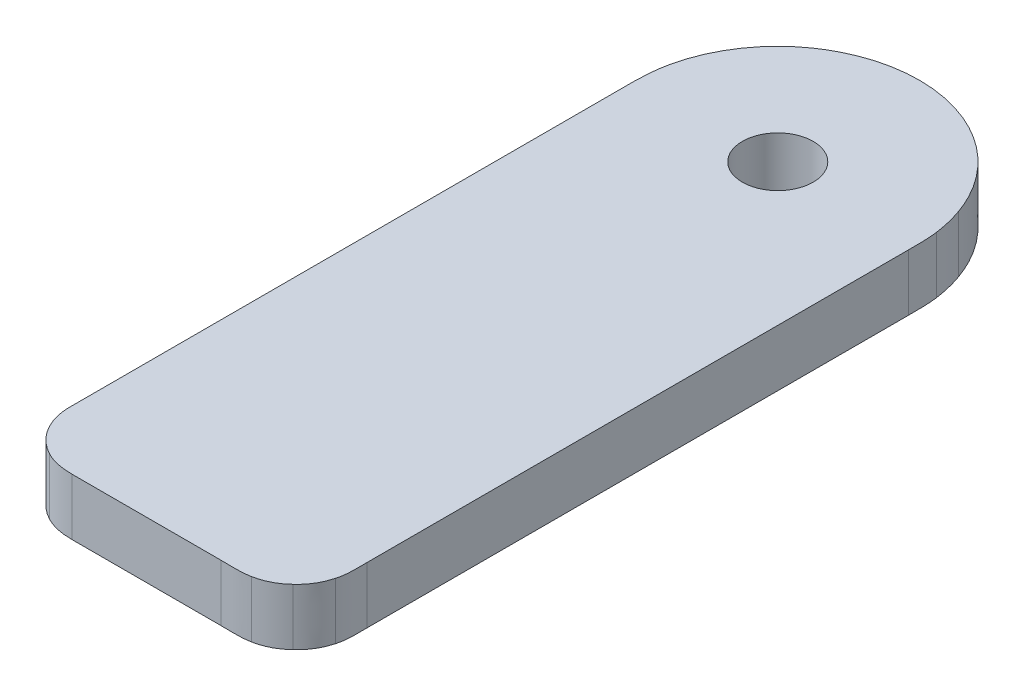
ISO-10303-21;
HEADER;
FILE_DESCRIPTION(('STEP AP214'),'2;1');
FILE_NAME('part.step','',(''),(''),'','','');
FILE_SCHEMA(('AUTOMOTIVE_DESIGN { 1 0 10303 214 1 1 1 1 }'));
ENDSEC;
DATA;
#1=APPLICATION_CONTEXT('core data for automotive mechanical design processes');
#2=APPLICATION_PROTOCOL_DEFINITION('international standard','automotive_design',2000,#1);
#3=PRODUCT_CONTEXT('',#1,'mechanical');
#4=PRODUCT('Part','Part','',(#3));
#5=PRODUCT_RELATED_PRODUCT_CATEGORY('part','',(#4));
#6=PRODUCT_DEFINITION_FORMATION('','',#4);
#7=PRODUCT_DEFINITION_CONTEXT('part definition',#1,'design');
#8=PRODUCT_DEFINITION('design','',#6,#7);
#9=PRODUCT_DEFINITION_SHAPE('','',#8);
#10=(LENGTH_UNIT() NAMED_UNIT(*) SI_UNIT(.MILLI.,.METRE.));
#11=(NAMED_UNIT(*) PLANE_ANGLE_UNIT() SI_UNIT($,.RADIAN.));
#12=(NAMED_UNIT(*) SI_UNIT($,.STERADIAN.) SOLID_ANGLE_UNIT());
#13=UNCERTAINTY_MEASURE_WITH_UNIT(LENGTH_MEASURE(1.E-05),#10,'distance_accuracy_value','');
#14=(GEOMETRIC_REPRESENTATION_CONTEXT(3) GLOBAL_UNCERTAINTY_ASSIGNED_CONTEXT((#13)) GLOBAL_UNIT_ASSIGNED_CONTEXT((#10,
#11,#12)) REPRESENTATION_CONTEXT('',''));
#15=CARTESIAN_POINT('',(0.,0.,0.));
#16=DIRECTION('',(0.,0.,1.));
#17=DIRECTION('',(1.,0.,0.));
#18=AXIS2_PLACEMENT_3D('',#15,#16,#17);
#19=CARTESIAN_POINT('',(3.65328200000971,6.35,-0.952753999994893));
#20=CARTESIAN_POINT('',(1.53731761965444,6.35,-2.04532759899768));
#21=CARTESIAN_POINT('',(0.219425103483956,6.35,-4.22738339059295));
#22=CARTESIAN_POINT('',(0.228904799999956,6.35,-6.61454614173407));
#23=B_SPLINE_CURVE_WITH_KNOTS('',3,(#19,#20,#21,#22),.UNSPECIFIED.,.F.,.F.,(4,4),
(-1.54492839249472E-12,1.00358621175948),.UNSPECIFIED.);
#24=DIRECTION('',(0.,-1.,0.));
#25=VECTOR('',#24,1.);
#26=SURFACE_OF_LINEAR_EXTRUSION('',#23,#25);
#27=CARTESIAN_POINT('',(3.65328200000971,0.,-0.952753999994893));
#28=CARTESIAN_POINT('',(1.53731761965444,0.,-2.04532759899768));
#29=CARTESIAN_POINT('',(0.219425103483956,0.,-4.22738339059295));
#30=CARTESIAN_POINT('',(0.228904799999956,0.,-6.61454614173407));
#31=B_SPLINE_CURVE_WITH_KNOTS('',3,(#27,#28,#29,#30),.UNSPECIFIED.,.F.,.F.,(4,4),
(-1.54492839249472E-12,1.00358621175948),.UNSPECIFIED.);
#32=CARTESIAN_POINT('',(3.653282,0.,-0.952754));
#33=VERTEX_POINT('',#32);
#34=CARTESIAN_POINT('',(0.2289048,0.,-6.61200614173541));
#35=VERTEX_POINT('',#34);
#36=EDGE_CURVE('E320',#33,#35,#31,.T.);
#37=ORIENTED_EDGE('',*,*,#36,.F.);
#38=DIRECTION('',(0.,-1.,0.));
#39=VECTOR('',#38,1.);
#40=CARTESIAN_POINT('',(3.653282,6.35,-0.952754));
#41=LINE('',#40,#39);
#42=CARTESIAN_POINT('',(3.653282,6.35,-0.952754));
#43=VERTEX_POINT('',#42);
#44=EDGE_CURVE('E11',#43,#33,#41,.T.);
#45=ORIENTED_EDGE('',*,*,#44,.F.);
#46=CARTESIAN_POINT('',(0.2289048,6.35,-6.61200614173541));
#47=VERTEX_POINT('',#46);
#48=EDGE_CURVE('E281',#43,#47,#23,.T.);
#49=ORIENTED_EDGE('',*,*,#48,.T.);
#50=DIRECTION('',(0.,-1.,0.));
#51=VECTOR('',#50,1.);
#52=CARTESIAN_POINT('',(0.2289048,6.35,-6.61200614173541));
#53=LINE('',#52,#51);
#54=EDGE_CURVE('E49',#47,#35,#53,.T.);
#55=ORIENTED_EDGE('',*,*,#54,.T.);
#56=EDGE_LOOP('',(#37,#45,#49,#55));
#57=FACE_BOUND('',#56,.T.);
#58=ADVANCED_FACE('F32',(#57),#26,.T.);
#59=CARTESIAN_POINT('',(6.8778882,6.35,-0.2430526));
#60=CARTESIAN_POINT('',(5.7272428,6.35,-0.2430526));
#61=CARTESIAN_POINT('',(4.7006002,6.35,-0.4155694));
#62=CARTESIAN_POINT('',(3.653282,6.35,-0.952754));
#63=B_SPLINE_CURVE_WITH_KNOTS('',3,(#59,#60,#61,#62),.UNSPECIFIED.,.F.,.F.,(4,4),(0.,1.),.UNSPECIFIED.);
#64=DIRECTION('',(0.,-1.,0.));
#65=VECTOR('',#64,1.);
#66=SURFACE_OF_LINEAR_EXTRUSION('',#63,#65);
#67=CARTESIAN_POINT('',(6.8778882,0.,-0.2430526));
#68=CARTESIAN_POINT('',(5.7272428,0.,-0.2430526));
#69=CARTESIAN_POINT('',(4.7006002,0.,-0.4155694));
#70=CARTESIAN_POINT('',(3.653282,0.,-0.952754));
#71=B_SPLINE_CURVE_WITH_KNOTS('',3,(#67,#68,#69,#70),.UNSPECIFIED.,.F.,.F.,(4,4),(0.,1.),.UNSPECIFIED.);
#72=CARTESIAN_POINT('',(6.8778882,0.,-0.2430526));
#73=VERTEX_POINT('',#72);
#74=EDGE_CURVE('E318',#73,#33,#71,.T.);
#75=ORIENTED_EDGE('',*,*,#74,.F.);
#76=DIRECTION('',(0.,-1.,0.));
#77=VECTOR('',#76,1.);
#78=CARTESIAN_POINT('',(6.8778882,6.35,-0.2430526));
#79=LINE('',#78,#77);
#80=CARTESIAN_POINT('',(6.8778882,6.35,-0.2430526));
#81=VERTEX_POINT('',#80);
#82=EDGE_CURVE('E41',#81,#73,#79,.T.);
#83=ORIENTED_EDGE('',*,*,#82,.F.);
#84=EDGE_CURVE('E275',#81,#43,#63,.T.);
#85=ORIENTED_EDGE('',*,*,#84,.T.);
#86=ORIENTED_EDGE('',*,*,#44,.T.);
#87=EDGE_LOOP('',(#75,#83,#85,#86));
#88=FACE_BOUND('',#87,.T.);
#89=ADVANCED_FACE('F270',(#88),#66,.T.);
#90=CARTESIAN_POINT('',(0.,6.35,-0.2430526));
#91=DIRECTION('',(0.,0.,1.));
#92=DIRECTION('',(1.,0.,0.));
#93=AXIS2_PLACEMENT_3D('',#90,#91,#92);
#94=PLANE('',#93);
#95=DIRECTION('',(-1.,0.,0.));
#96=VECTOR('',#95,1.);
#97=CARTESIAN_POINT('',(0.,0.,-0.2430526));
#98=LINE('',#97,#96);
#99=CARTESIAN_POINT('',(23.5728256,0.,-0.2430526));
#100=VERTEX_POINT('',#99);
#101=EDGE_CURVE('E315',#100,#73,#98,.T.);
#102=ORIENTED_EDGE('',*,*,#101,.F.);
#103=DIRECTION('',(0.,-1.,0.));
#104=VECTOR('',#103,1.);
#105=CARTESIAN_POINT('',(23.5728256,6.35,-0.2430526));
#106=LINE('',#105,#104);
#107=CARTESIAN_POINT('',(23.5728256,6.35,-0.2430526));
#108=VERTEX_POINT('',#107);
#109=EDGE_CURVE('E293',#108,#100,#106,.T.);
#110=ORIENTED_EDGE('',*,*,#109,.F.);
#111=DIRECTION('',(-1.,0.,0.));
#112=VECTOR('',#111,1.);
#113=CARTESIAN_POINT('',(0.,6.35,-0.2430526));
#114=LINE('',#113,#112);
#115=EDGE_CURVE('E280',#108,#81,#114,.T.);
#116=ORIENTED_EDGE('',*,*,#115,.T.);
#117=ORIENTED_EDGE('',*,*,#82,.T.);
#118=EDGE_LOOP('',(#102,#110,#116,#117));
#119=FACE_BOUND('',#118,.T.);
#120=ADVANCED_FACE('F267',(#119),#94,.T.);
#121=CARTESIAN_POINT('',(26.8525752,6.35,-0.3600704));
#122=CARTESIAN_POINT('',(25.756997,6.35,-0.146558));
#123=CARTESIAN_POINT('',(24.6683784,6.35,-0.2430526));
#124=CARTESIAN_POINT('',(23.5728256,6.35,-0.2430526));
#125=B_SPLINE_CURVE_WITH_KNOTS('',3,(#121,#122,#123,#124),.UNSPECIFIED.,.F.,.F.,(4,4),(0.,1.),.UNSPECIFIED.);
#126=DIRECTION('',(0.,-1.,0.));
#127=VECTOR('',#126,1.);
#128=SURFACE_OF_LINEAR_EXTRUSION('',#125,#127);
#129=CARTESIAN_POINT('',(26.8525752,0.,-0.3600704));
#130=CARTESIAN_POINT('',(25.756997,0.,-0.146558));
#131=CARTESIAN_POINT('',(24.6683784,0.,-0.2430526));
#132=CARTESIAN_POINT('',(23.5728256,0.,-0.2430526));
#133=B_SPLINE_CURVE_WITH_KNOTS('',3,(#129,#130,#131,#132),.UNSPECIFIED.,.F.,.F.,(4,4),(0.,1.),.UNSPECIFIED.);
#134=CARTESIAN_POINT('',(26.8525752,0.,-0.3600704));
#135=VERTEX_POINT('',#134);
#136=EDGE_CURVE('E324',#135,#100,#133,.T.);
#137=ORIENTED_EDGE('',*,*,#136,.F.);
#138=DIRECTION('',(0.,-1.,0.));
#139=VECTOR('',#138,1.);
#140=CARTESIAN_POINT('',(26.8525752,6.35,-0.3600704));
#141=LINE('',#140,#139);
#142=CARTESIAN_POINT('',(26.8525752,6.35,-0.3600704));
#143=VERTEX_POINT('',#142);
#144=EDGE_CURVE('E295',#143,#135,#141,.T.);
#145=ORIENTED_EDGE('',*,*,#144,.F.);
#146=EDGE_CURVE('E252',#143,#108,#125,.T.);
#147=ORIENTED_EDGE('',*,*,#146,.T.);
#148=ORIENTED_EDGE('',*,*,#109,.T.);
#149=EDGE_LOOP('',(#137,#145,#147,#148));
#150=FACE_BOUND('',#149,.T.);
#151=ADVANCED_FACE('F263',(#150),#128,.T.);
#152=CARTESIAN_POINT('',(29.939361,6.35,-1.9310096));
#153=CARTESIAN_POINT('',(29.0298632,6.35,-1.0835132));
#154=CARTESIAN_POINT('',(28.0721054,6.35,-0.601218));
#155=CARTESIAN_POINT('',(26.8525752,6.35,-0.3600704));
#156=B_SPLINE_CURVE_WITH_KNOTS('',3,(#152,#153,#154,#155),.UNSPECIFIED.,.F.,.F.,(4,4),(0.,1.),.UNSPECIFIED.);
#157=DIRECTION('',(0.,-1.,0.));
#158=VECTOR('',#157,1.);
#159=SURFACE_OF_LINEAR_EXTRUSION('',#156,#158);
#160=CARTESIAN_POINT('',(29.939361,0.,-1.9310096));
#161=CARTESIAN_POINT('',(29.0298632,0.,-1.0835132));
#162=CARTESIAN_POINT('',(28.0721054,0.,-0.601218));
#163=CARTESIAN_POINT('',(26.8525752,0.,-0.3600704));
#164=B_SPLINE_CURVE_WITH_KNOTS('',3,(#160,#161,#162,#163),.UNSPECIFIED.,.F.,.F.,(4,4),(0.,1.),.UNSPECIFIED.);
#165=CARTESIAN_POINT('',(29.939361,0.,-1.9310096));
#166=VERTEX_POINT('',#165);
#167=EDGE_CURVE('E302',#166,#135,#164,.T.);
#168=ORIENTED_EDGE('',*,*,#167,.F.);
#169=DIRECTION('',(0.,-1.,0.));
#170=VECTOR('',#169,1.);
#171=CARTESIAN_POINT('',(29.939361,6.35,-1.9310096));
#172=LINE('',#171,#170);
#173=CARTESIAN_POINT('',(29.939361,6.35,-1.9310096));
#174=VERTEX_POINT('',#173);
#175=EDGE_CURVE('E300',#174,#166,#172,.T.);
#176=ORIENTED_EDGE('',*,*,#175,.F.);
#177=EDGE_CURVE('E243',#174,#143,#156,.T.);
#178=ORIENTED_EDGE('',*,*,#177,.T.);
#179=ORIENTED_EDGE('',*,*,#144,.T.);
#180=EDGE_LOOP('',(#168,#176,#178,#179));
#181=FACE_BOUND('',#180,.T.);
#182=ADVANCED_FACE('F260',(#181),#159,.T.);
#183=CARTESIAN_POINT('',(31.7514732,6.35,-4.9144682));
#184=CARTESIAN_POINT('',(31.4207398,6.35,-3.7087048));
#185=CARTESIAN_POINT('',(30.8557676,6.35,-2.778506));
#186=CARTESIAN_POINT('',(29.939361,6.35,-1.9310096));
#187=B_SPLINE_CURVE_WITH_KNOTS('',3,(#183,#184,#185,#186),.UNSPECIFIED.,.F.,.F.,(4,4),(0.,1.),.UNSPECIFIED.);
#188=DIRECTION('',(0.,-1.,0.));
#189=VECTOR('',#188,1.);
#190=SURFACE_OF_LINEAR_EXTRUSION('',#187,#189);
#191=CARTESIAN_POINT('',(31.7514732,0.,-4.9144682));
#192=CARTESIAN_POINT('',(31.4207398,0.,-3.7087048));
#193=CARTESIAN_POINT('',(30.8557676,0.,-2.778506));
#194=CARTESIAN_POINT('',(29.939361,0.,-1.9310096));
#195=B_SPLINE_CURVE_WITH_KNOTS('',3,(#191,#192,#193,#194),.UNSPECIFIED.,.F.,.F.,(4,4),(0.,1.),.UNSPECIFIED.);
#196=CARTESIAN_POINT('',(31.7514732,0.,-4.9144682));
#197=VERTEX_POINT('',#196);
#198=EDGE_CURVE('E339',#197,#166,#195,.T.);
#199=ORIENTED_EDGE('',*,*,#198,.F.);
#200=DIRECTION('',(0.,-1.,0.));
#201=VECTOR('',#200,1.);
#202=CARTESIAN_POINT('',(31.7514732,6.35,-4.9144682));
#203=LINE('',#202,#201);
#204=CARTESIAN_POINT('',(31.7514732,6.35,-4.9144682));
#205=VERTEX_POINT('',#204);
#206=EDGE_CURVE('E306',#205,#197,#203,.T.);
#207=ORIENTED_EDGE('',*,*,#206,.F.);
#208=EDGE_CURVE('E234',#205,#174,#187,.T.);
#209=ORIENTED_EDGE('',*,*,#208,.T.);
#210=ORIENTED_EDGE('',*,*,#175,.T.);
#211=EDGE_LOOP('',(#199,#207,#209,#210));
#212=FACE_BOUND('',#211,.T.);
#213=ADVANCED_FACE('F225',(#212),#190,.T.);
#214=CARTESIAN_POINT('',(31.9788794,6.35,-8.187309));
#215=CARTESIAN_POINT('',(31.9788794,6.35,-7.0917562));
#216=CARTESIAN_POINT('',(32.0547238,6.35,-6.010021));
#217=CARTESIAN_POINT('',(31.7514732,6.35,-4.9144682));
#218=B_SPLINE_CURVE_WITH_KNOTS('',3,(#214,#215,#216,#217),.UNSPECIFIED.,.F.,.F.,(4,4),(0.,1.),.UNSPECIFIED.);
#219=DIRECTION('',(0.,-1.,0.));
#220=VECTOR('',#219,1.);
#221=SURFACE_OF_LINEAR_EXTRUSION('',#218,#220);
#222=CARTESIAN_POINT('',(31.9788794,0.,-8.187309));
#223=CARTESIAN_POINT('',(31.9788794,0.,-7.0917562));
#224=CARTESIAN_POINT('',(32.0547238,0.,-6.010021));
#225=CARTESIAN_POINT('',(31.7514732,0.,-4.9144682));
#226=B_SPLINE_CURVE_WITH_KNOTS('',3,(#222,#223,#224,#225),.UNSPECIFIED.,.F.,.F.,(4,4),(0.,1.),.UNSPECIFIED.);
#227=CARTESIAN_POINT('',(31.9788794,0.,-8.187309));
#228=VERTEX_POINT('',#227);
#229=EDGE_CURVE('E346',#228,#197,#226,.T.);
#230=ORIENTED_EDGE('',*,*,#229,.F.);
#231=DIRECTION('',(0.,-1.,0.));
#232=VECTOR('',#231,1.);
#233=CARTESIAN_POINT('',(31.9788794,6.35,-8.187309));
#234=LINE('',#233,#232);
#235=CARTESIAN_POINT('',(31.9788794,6.35,-8.187309));
#236=VERTEX_POINT('',#235);
#237=EDGE_CURVE('E309',#236,#228,#234,.T.);
#238=ORIENTED_EDGE('',*,*,#237,.F.);
#239=EDGE_CURVE('E229',#236,#205,#218,.T.);
#240=ORIENTED_EDGE('',*,*,#239,.T.);
#241=ORIENTED_EDGE('',*,*,#206,.T.);
#242=EDGE_LOOP('',(#230,#238,#240,#241));
#243=FACE_BOUND('',#242,.T.);
#244=ADVANCED_FACE('F221',(#243),#221,.T.);
#245=CARTESIAN_POINT('',(31.9788794,6.35,0.));
#246=DIRECTION('',(1.,0.,0.));
#247=DIRECTION('',(0.,0.,-1.));
#248=AXIS2_PLACEMENT_3D('',#245,#246,#247);
#249=PLANE('',#248);
#250=DIRECTION('',(0.,0.,1.));
#251=VECTOR('',#250,1.);
#252=CARTESIAN_POINT('',(31.9788794,0.,0.));
#253=LINE('',#252,#251);
#254=CARTESIAN_POINT('',(31.9788794,0.,-68.8967634));
#255=VERTEX_POINT('',#254);
#256=EDGE_CURVE('E354',#255,#228,#253,.T.);
#257=ORIENTED_EDGE('',*,*,#256,.F.);
#258=DIRECTION('',(0.,-1.,0.));
#259=VECTOR('',#258,1.);
#260=CARTESIAN_POINT('',(31.9788794,6.35,-68.8967634));
#261=LINE('',#260,#259);
#262=CARTESIAN_POINT('',(31.9788794,6.35,-68.8967634));
#263=VERTEX_POINT('',#262);
#264=EDGE_CURVE('E410',#263,#255,#261,.T.);
#265=ORIENTED_EDGE('',*,*,#264,.F.);
#266=DIRECTION('',(0.,0.,1.));
#267=VECTOR('',#266,1.);
#268=CARTESIAN_POINT('',(31.9788794,6.35,0.));
#269=LINE('',#268,#267);
#270=EDGE_CURVE('E209',#263,#236,#269,.T.);
#271=ORIENTED_EDGE('',*,*,#270,.T.);
#272=ORIENTED_EDGE('',*,*,#237,.T.);
#273=EDGE_LOOP('',(#257,#265,#271,#272));
#274=FACE_BOUND('',#273,.T.);
#275=ADVANCED_FACE('F217',(#274),#249,.T.);
#276=CARTESIAN_POINT('',(31.8479678,6.35,-72.1627208));
#277=CARTESIAN_POINT('',(31.9857374,6.35,-71.0740514));
#278=CARTESIAN_POINT('',(31.9788794,6.35,-69.9854074));
#279=CARTESIAN_POINT('',(31.9788794,6.35,-68.8967634));
#280=B_SPLINE_CURVE_WITH_KNOTS('',3,(#276,#277,#278,#279),.UNSPECIFIED.,.F.,.F.,(4,4),(0.,1.),.UNSPECIFIED.);
#281=DIRECTION('',(0.,-1.,0.));
#282=VECTOR('',#281,1.);
#283=SURFACE_OF_LINEAR_EXTRUSION('',#280,#282);
#284=CARTESIAN_POINT('',(31.8479678,0.,-72.1627208));
#285=CARTESIAN_POINT('',(31.9857374,0.,-71.0740514));
#286=CARTESIAN_POINT('',(31.9788794,0.,-69.9854074));
#287=CARTESIAN_POINT('',(31.9788794,0.,-68.8967634));
#288=B_SPLINE_CURVE_WITH_KNOTS('',3,(#284,#285,#286,#287),.UNSPECIFIED.,.F.,.F.,(4,4),(0.,1.),.UNSPECIFIED.);
#289=CARTESIAN_POINT('',(31.8479678,0.,-72.1627208));
#290=VERTEX_POINT('',#289);
#291=EDGE_CURVE('E360',#290,#255,#288,.T.);
#292=ORIENTED_EDGE('',*,*,#291,.F.);
#293=DIRECTION('',(0.,-1.,0.));
#294=VECTOR('',#293,1.);
#295=CARTESIAN_POINT('',(31.8479678,6.35,-72.1627208));
#296=LINE('',#295,#294);
#297=CARTESIAN_POINT('',(31.8479678,6.35,-72.1627208));
#298=VERTEX_POINT('',#297);
#299=EDGE_CURVE('E408',#298,#290,#296,.T.);
#300=ORIENTED_EDGE('',*,*,#299,.F.);
#301=EDGE_CURVE('E200',#298,#263,#280,.T.);
#302=ORIENTED_EDGE('',*,*,#301,.T.);
#303=ORIENTED_EDGE('',*,*,#264,.T.);
#304=EDGE_LOOP('',(#292,#300,#302,#303));
#305=FACE_BOUND('',#304,.T.);
#306=ADVANCED_FACE('F214',(#305),#283,.T.);
#307=CARTESIAN_POINT('',(31.048706,6.35,-75.4562626));
#308=CARTESIAN_POINT('',(31.4345574,6.35,-74.38136));
#309=CARTESIAN_POINT('',(31.6963806,6.35,-73.292716));
#310=CARTESIAN_POINT('',(31.8479678,6.35,-72.1627208));
#311=B_SPLINE_CURVE_WITH_KNOTS('',3,(#307,#308,#309,#310),.UNSPECIFIED.,.F.,.F.,(4,4),(0.,1.),.UNSPECIFIED.);
#312=DIRECTION('',(0.,-1.,0.));
#313=VECTOR('',#312,1.);
#314=SURFACE_OF_LINEAR_EXTRUSION('',#311,#313);
#315=CARTESIAN_POINT('',(31.048706,0.,-75.4562626));
#316=CARTESIAN_POINT('',(31.4345574,0.,-74.38136));
#317=CARTESIAN_POINT('',(31.6963806,0.,-73.292716));
#318=CARTESIAN_POINT('',(31.8479678,0.,-72.1627208));
#319=B_SPLINE_CURVE_WITH_KNOTS('',3,(#315,#316,#317,#318),.UNSPECIFIED.,.F.,.F.,(4,4),(0.,1.),.UNSPECIFIED.);
#320=CARTESIAN_POINT('',(31.048706,0.,-75.4562626));
#321=VERTEX_POINT('',#320);
#322=EDGE_CURVE('E365',#321,#290,#319,.T.);
#323=ORIENTED_EDGE('',*,*,#322,.F.);
#324=DIRECTION('',(0.,-1.,0.));
#325=VECTOR('',#324,1.);
#326=CARTESIAN_POINT('',(31.048706,6.35,-75.4562626));
#327=LINE('',#326,#325);
#328=CARTESIAN_POINT('',(31.048706,6.35,-75.4562626));
#329=VERTEX_POINT('',#328);
#330=EDGE_CURVE('E406',#329,#321,#327,.T.);
#331=ORIENTED_EDGE('',*,*,#330,.F.);
#332=EDGE_CURVE('E191',#329,#298,#311,.T.);
#333=ORIENTED_EDGE('',*,*,#332,.T.);
#334=ORIENTED_EDGE('',*,*,#299,.T.);
#335=EDGE_LOOP('',(#323,#331,#333,#334));
#336=FACE_BOUND('',#335,.T.);
#337=ADVANCED_FACE('F184',(#336),#314,.T.);
#338=CARTESIAN_POINT('',(8.8967564,6.35,-84.2550004));
#339=CARTESIAN_POINT('',(17.4474886,6.35,-88.6096018));
#340=CARTESIAN_POINT('',(27.8240998,6.35,-84.4895186));
#341=CARTESIAN_POINT('',(31.048706,6.35,-75.4562626));
#342=B_SPLINE_CURVE_WITH_KNOTS('',3,(#338,#339,#340,#341),.UNSPECIFIED.,.F.,.F.,(4,4),(0.,1.),.UNSPECIFIED.);
#343=DIRECTION('',(0.,-1.,0.));
#344=VECTOR('',#343,1.);
#345=SURFACE_OF_LINEAR_EXTRUSION('',#342,#344);
#346=CARTESIAN_POINT('',(8.8967564,0.,-84.2550004));
#347=CARTESIAN_POINT('',(17.4474886,0.,-88.6096018));
#348=CARTESIAN_POINT('',(27.8240998,0.,-84.4895186));
#349=CARTESIAN_POINT('',(31.048706,0.,-75.4562626));
#350=B_SPLINE_CURVE_WITH_KNOTS('',3,(#346,#347,#348,#349),.UNSPECIFIED.,.F.,.F.,(4,4),(0.,1.),.UNSPECIFIED.);
#351=CARTESIAN_POINT('',(8.8967564,0.,-84.2550004));
#352=VERTEX_POINT('',#351);
#353=EDGE_CURVE('E373',#352,#321,#350,.T.);
#354=ORIENTED_EDGE('',*,*,#353,.F.);
#355=DIRECTION('',(0.,-1.,0.));
#356=VECTOR('',#355,1.);
#357=CARTESIAN_POINT('',(8.8967564,6.35,-84.2550004));
#358=LINE('',#357,#356);
#359=CARTESIAN_POINT('',(8.8967564,6.35,-84.2550004));
#360=VERTEX_POINT('',#359);
#361=EDGE_CURVE('E144',#360,#352,#358,.T.);
#362=ORIENTED_EDGE('',*,*,#361,.F.);
#363=EDGE_CURVE('E155',#360,#329,#342,.T.);
#364=ORIENTED_EDGE('',*,*,#363,.T.);
#365=ORIENTED_EDGE('',*,*,#330,.T.);
#366=EDGE_LOOP('',(#354,#362,#364,#365));
#367=FACE_BOUND('',#366,.T.);
#368=ADVANCED_FACE('F181',(#367),#345,.T.);
#369=CARTESIAN_POINT('',(0.6078474,6.35,-73.5821236));
#370=CARTESIAN_POINT('',(1.6413734,6.35,-78.1985736));
#371=CARTESIAN_POINT('',(4.6799754,6.35,-82.1121548));
#372=CARTESIAN_POINT('',(8.8967564,6.35,-84.2550004));
#373=B_SPLINE_CURVE_WITH_KNOTS('',3,(#369,#370,#371,#372),.UNSPECIFIED.,.F.,.F.,(4,4),(0.,1.),.UNSPECIFIED.);
#374=DIRECTION('',(0.,-1.,0.));
#375=VECTOR('',#374,1.);
#376=SURFACE_OF_LINEAR_EXTRUSION('',#373,#375);
#377=CARTESIAN_POINT('',(0.6078474,0.,-73.5821236));
#378=CARTESIAN_POINT('',(1.6413734,0.,-78.1985736));
#379=CARTESIAN_POINT('',(4.6799754,0.,-82.1121548));
#380=CARTESIAN_POINT('',(8.8967564,0.,-84.2550004));
#381=B_SPLINE_CURVE_WITH_KNOTS('',3,(#377,#378,#379,#380),.UNSPECIFIED.,.F.,.F.,(4,4),(0.,1.),.UNSPECIFIED.);
#382=CARTESIAN_POINT('',(0.6078474,0.,-73.5821236));
#383=VERTEX_POINT('',#382);
#384=EDGE_CURVE('E140',#383,#352,#381,.T.);
#385=ORIENTED_EDGE('',*,*,#384,.F.);
#386=DIRECTION('',(0.,-1.,0.));
#387=VECTOR('',#386,1.);
#388=CARTESIAN_POINT('',(0.6078474,6.35,-73.5821236));
#389=LINE('',#388,#387);
#390=CARTESIAN_POINT('',(0.6078474,6.35,-73.5821236));
#391=VERTEX_POINT('',#390);
#392=EDGE_CURVE('E135',#391,#383,#389,.T.);
#393=ORIENTED_EDGE('',*,*,#392,.F.);
#394=EDGE_CURVE('E138',#391,#360,#373,.T.);
#395=ORIENTED_EDGE('',*,*,#394,.T.);
#396=ORIENTED_EDGE('',*,*,#361,.T.);
#397=EDGE_LOOP('',(#385,#393,#395,#396));
#398=FACE_BOUND('',#397,.T.);
#399=ADVANCED_FACE('F137',(#398),#376,.T.);
#400=CARTESIAN_POINT('',(0.2289048,6.35,-67.1604702));
#401=CARTESIAN_POINT('',(0.2289048,6.35,-69.3101738));
#402=CARTESIAN_POINT('',(0.1324102,6.35,-71.4323692));
#403=CARTESIAN_POINT('',(0.6078474,6.35,-73.5821236));
#404=B_SPLINE_CURVE_WITH_KNOTS('',3,(#400,#401,#402,#403),.UNSPECIFIED.,.F.,.F.,(4,4),(0.,1.),.UNSPECIFIED.);
#405=DIRECTION('',(0.,-1.,0.));
#406=VECTOR('',#405,1.);
#407=SURFACE_OF_LINEAR_EXTRUSION('',#404,#406);
#408=CARTESIAN_POINT('',(0.2289048,0.,-67.1604702));
#409=CARTESIAN_POINT('',(0.2289048,0.,-69.3101738));
#410=CARTESIAN_POINT('',(0.1324102,0.,-71.4323692));
#411=CARTESIAN_POINT('',(0.6078474,0.,-73.5821236));
#412=B_SPLINE_CURVE_WITH_KNOTS('',3,(#408,#409,#410,#411),.UNSPECIFIED.,.F.,.F.,(4,4),(0.,1.),.UNSPECIFIED.);
#413=CARTESIAN_POINT('',(0.2289048,0.,-67.1604702));
#414=VERTEX_POINT('',#413);
#415=EDGE_CURVE('E387',#414,#383,#412,.T.);
#416=ORIENTED_EDGE('',*,*,#415,.F.);
#417=DIRECTION('',(0.,-1.,0.));
#418=VECTOR('',#417,1.);
#419=CARTESIAN_POINT('',(0.2289048,6.35,-67.1604702));
#420=LINE('',#419,#418);
#421=CARTESIAN_POINT('',(0.2289048,6.35,-67.1604702));
#422=VERTEX_POINT('',#421);
#423=EDGE_CURVE('E92',#422,#414,#420,.T.);
#424=ORIENTED_EDGE('',*,*,#423,.F.);
#425=EDGE_CURVE('E152',#422,#391,#404,.T.);
#426=ORIENTED_EDGE('',*,*,#425,.T.);
#427=ORIENTED_EDGE('',*,*,#392,.T.);
#428=EDGE_LOOP('',(#416,#424,#426,#427));
#429=FACE_BOUND('',#428,.T.);
#430=ADVANCED_FACE('F157',(#429),#407,.T.);
#431=CARTESIAN_POINT('',(0.2289048,6.35,0.));
#432=DIRECTION('',(-1.,0.,0.));
#433=DIRECTION('',(0.,0.,1.));
#434=AXIS2_PLACEMENT_3D('',#431,#432,#433);
#435=PLANE('',#434);
#436=DIRECTION('',(0.,0.,-1.));
#437=VECTOR('',#436,1.);
#438=CARTESIAN_POINT('',(0.2289048,0.,0.));
#439=LINE('',#438,#437);
#440=EDGE_CURVE('E394',#35,#414,#439,.T.);
#441=ORIENTED_EDGE('',*,*,#440,.F.);
#442=ORIENTED_EDGE('',*,*,#54,.F.);
#443=DIRECTION('',(0.,0.,-1.));
#444=VECTOR('',#443,1.);
#445=CARTESIAN_POINT('',(0.2289048,6.35,0.));
#446=LINE('',#445,#444);
#447=EDGE_CURVE('E158',#47,#422,#446,.T.);
#448=ORIENTED_EDGE('',*,*,#447,.T.);
#449=ORIENTED_EDGE('',*,*,#423,.T.);
#450=EDGE_LOOP('',(#441,#442,#448,#449));
#451=FACE_BOUND('',#450,.T.);
#452=ADVANCED_FACE('F177',(#451),#435,.T.);
#453=CARTESIAN_POINT('',(16.096996,6.35,-70.13702));
#454=DIRECTION('',(0.,-1.,0.));
#455=DIRECTION('',(0.,0.,-1.));
#456=AXIS2_PLACEMENT_3D('',#453,#454,#455);
#457=CYLINDRICAL_SURFACE('',#456,3.96875);
#458=CARTESIAN_POINT('',(16.096996,6.35,-70.13702));
#459=DIRECTION('',(0.,1.,0.));
#460=DIRECTION('',(0.,0.,1.));
#461=AXIS2_PLACEMENT_3D('',#458,#459,#460);
#462=CIRCLE('',#461,3.96875);
#463=CARTESIAN_POINT('',(16.096996,6.35,-66.16827));
#464=VERTEX_POINT('',#463);
#465=EDGE_CURVE('E160',#464,#464,#462,.T.);
#466=ORIENTED_EDGE('',*,*,#465,.T.);
#467=EDGE_LOOP('',(#466));
#468=FACE_BOUND('',#467,.T.);
#469=CARTESIAN_POINT('',(16.096996,0.,-70.13702));
#470=DIRECTION('',(0.,1.,0.));
#471=DIRECTION('',(0.,0.,1.));
#472=AXIS2_PLACEMENT_3D('',#469,#470,#471);
#473=CIRCLE('',#472,3.96875);
#474=CARTESIAN_POINT('',(16.096996,0.,-66.16827));
#475=VERTEX_POINT('',#474);
#476=EDGE_CURVE('E400',#475,#475,#473,.T.);
#477=ORIENTED_EDGE('',*,*,#476,.F.);
#478=EDGE_LOOP('',(#477));
#479=FACE_BOUND('',#478,.T.);
#480=ADVANCED_FACE('F433',(#468,#479),#457,.F.);
#481=CARTESIAN_POINT('',(0.,6.35,0.));
#482=DIRECTION('',(0.,1.,0.));
#483=DIRECTION('',(0.,0.,1.));
#484=AXIS2_PLACEMENT_3D('',#481,#482,#483);
#485=PLANE('',#484);
#486=ORIENTED_EDGE('',*,*,#48,.F.);
#487=ORIENTED_EDGE('',*,*,#84,.F.);
#488=ORIENTED_EDGE('',*,*,#115,.F.);
#489=ORIENTED_EDGE('',*,*,#146,.F.);
#490=ORIENTED_EDGE('',*,*,#177,.F.);
#491=ORIENTED_EDGE('',*,*,#208,.F.);
#492=ORIENTED_EDGE('',*,*,#239,.F.);
#493=ORIENTED_EDGE('',*,*,#270,.F.);
#494=ORIENTED_EDGE('',*,*,#301,.F.);
#495=ORIENTED_EDGE('',*,*,#332,.F.);
#496=ORIENTED_EDGE('',*,*,#363,.F.);
#497=ORIENTED_EDGE('',*,*,#394,.F.);
#498=ORIENTED_EDGE('',*,*,#425,.F.);
#499=ORIENTED_EDGE('',*,*,#447,.F.);
#500=EDGE_LOOP('',(#486,#487,#488,#489,#490,#491,#492,#493,#494,#495,#496,#497,#498,#499));
#501=FACE_BOUND('',#500,.T.);
#502=ORIENTED_EDGE('',*,*,#465,.F.);
#503=EDGE_LOOP('',(#502));
#504=FACE_BOUND('',#503,.T.);
#505=ADVANCED_FACE('F149',(#501,#504),#485,.T.);
#506=CARTESIAN_POINT('',(0.,0.,0.));
#507=DIRECTION('',(0.,1.,0.));
#508=DIRECTION('',(0.,0.,1.));
#509=AXIS2_PLACEMENT_3D('',#506,#507,#508);
#510=PLANE('',#509);
#511=ORIENTED_EDGE('',*,*,#36,.T.);
#512=ORIENTED_EDGE('',*,*,#440,.T.);
#513=ORIENTED_EDGE('',*,*,#415,.T.);
#514=ORIENTED_EDGE('',*,*,#384,.T.);
#515=ORIENTED_EDGE('',*,*,#353,.T.);
#516=ORIENTED_EDGE('',*,*,#322,.T.);
#517=ORIENTED_EDGE('',*,*,#291,.T.);
#518=ORIENTED_EDGE('',*,*,#256,.T.);
#519=ORIENTED_EDGE('',*,*,#229,.T.);
#520=ORIENTED_EDGE('',*,*,#198,.T.);
#521=ORIENTED_EDGE('',*,*,#167,.T.);
#522=ORIENTED_EDGE('',*,*,#136,.T.);
#523=ORIENTED_EDGE('',*,*,#101,.T.);
#524=ORIENTED_EDGE('',*,*,#74,.T.);
#525=EDGE_LOOP('',(#511,#512,#513,#514,#515,#516,#517,#518,#519,#520,#521,#522,#523,#524));
#526=FACE_BOUND('',#525,.T.);
#527=ORIENTED_EDGE('',*,*,#476,.T.);
#528=EDGE_LOOP('',(#527));
#529=FACE_BOUND('',#528,.T.);
#530=ADVANCED_FACE('F322',(#526,#529),#510,.F.);
#531=CLOSED_SHELL('',(#58,#89,#120,#151,#182,#213,#244,#275,#306,#337,#368,#399,#430,#452,#480,
#505,#530));
#532=MANIFOLD_SOLID_BREP('B2',#531);
#533=ADVANCED_BREP_SHAPE_REPRESENTATION('',(#18,#532),#14);
#534=SHAPE_DEFINITION_REPRESENTATION(#9,#533);
ENDSEC;
END-ISO-10303-21;
